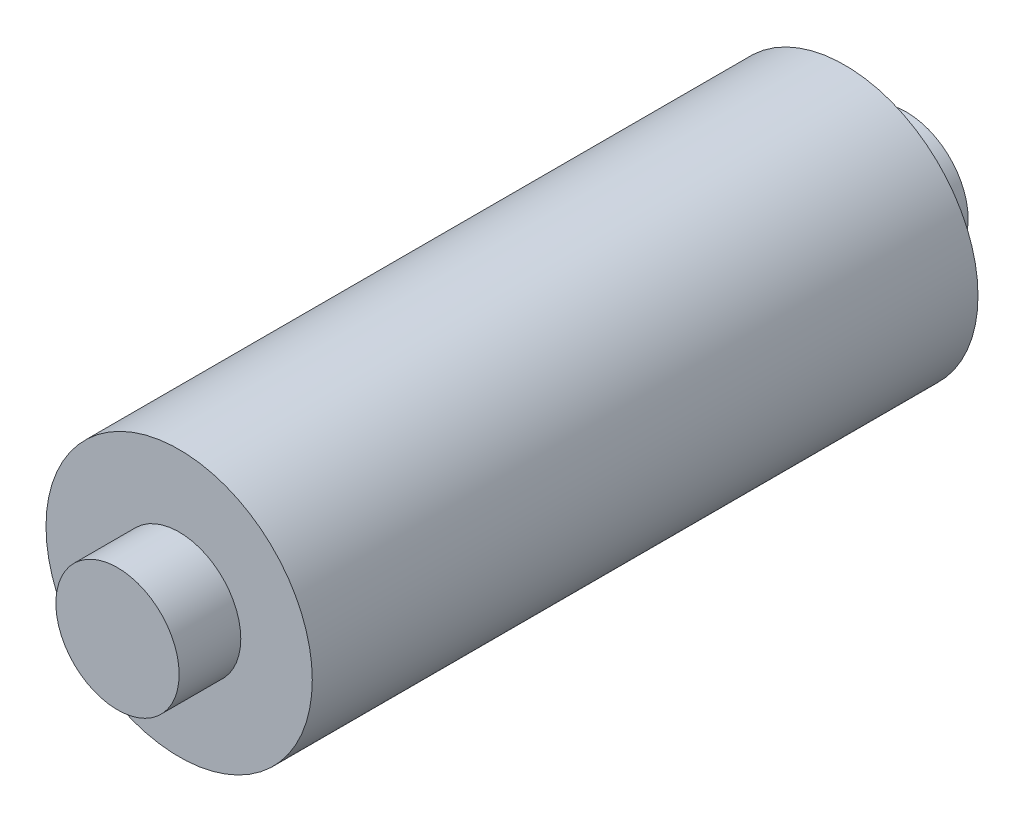
ISO-10303-21;
HEADER;
FILE_DESCRIPTION(('STEP AP214'),'2;1');
FILE_NAME('part.step','',(''),(''),'','','');
FILE_SCHEMA(('AUTOMOTIVE_DESIGN { 1 0 10303 214 1 1 1 1 }'));
ENDSEC;
DATA;
#1=APPLICATION_CONTEXT('core data for automotive mechanical design processes');
#2=APPLICATION_PROTOCOL_DEFINITION('international standard','automotive_design',2000,#1);
#3=PRODUCT_CONTEXT('',#1,'mechanical');
#4=PRODUCT('Part','Part','',(#3));
#5=PRODUCT_RELATED_PRODUCT_CATEGORY('part','',(#4));
#6=PRODUCT_DEFINITION_FORMATION('','',#4);
#7=PRODUCT_DEFINITION_CONTEXT('part definition',#1,'design');
#8=PRODUCT_DEFINITION('design','',#6,#7);
#9=PRODUCT_DEFINITION_SHAPE('','',#8);
#10=(LENGTH_UNIT() NAMED_UNIT(*) SI_UNIT(.MILLI.,.METRE.));
#11=(NAMED_UNIT(*) PLANE_ANGLE_UNIT() SI_UNIT($,.RADIAN.));
#12=(NAMED_UNIT(*) SI_UNIT($,.STERADIAN.) SOLID_ANGLE_UNIT());
#13=UNCERTAINTY_MEASURE_WITH_UNIT(LENGTH_MEASURE(1.E-05),#10,'distance_accuracy_value','');
#14=(GEOMETRIC_REPRESENTATION_CONTEXT(3) GLOBAL_UNCERTAINTY_ASSIGNED_CONTEXT((#13)) GLOBAL_UNIT_ASSIGNED_CONTEXT((#10,
#11,#12)) REPRESENTATION_CONTEXT('',''));
#15=CARTESIAN_POINT('',(0.,0.,0.));
#16=DIRECTION('',(0.,0.,1.));
#17=DIRECTION('',(1.,0.,0.));
#18=AXIS2_PLACEMENT_3D('',#15,#16,#17);
#19=CARTESIAN_POINT('',(0.,0.,0.));
#20=DIRECTION('',(0.,0.,1.));
#21=DIRECTION('',(1.,0.,0.));
#22=AXIS2_PLACEMENT_3D('',#19,#20,#21);
#23=PLANE('',#22);
#24=CARTESIAN_POINT('',(0.,0.,0.));
#25=DIRECTION('',(0.,0.,1.));
#26=DIRECTION('',(1.,0.,0.));
#27=AXIS2_PLACEMENT_3D('',#24,#25,#26);
#28=CIRCLE('',#27,54.);
#29=CARTESIAN_POINT('',(54.,0.,0.));
#30=VERTEX_POINT('',#29);
#31=EDGE_CURVE('E43',#30,#30,#28,.T.);
#32=ORIENTED_EDGE('',*,*,#31,.F.);
#33=EDGE_LOOP('',(#32));
#34=FACE_BOUND('',#33,.T.);
#35=CARTESIAN_POINT('',(0.,0.,0.));
#36=DIRECTION('',(0.,0.,1.));
#37=DIRECTION('',(1.,0.,0.));
#38=AXIS2_PLACEMENT_3D('',#35,#36,#37);
#39=CIRCLE('',#38,25.);
#40=CARTESIAN_POINT('',(25.,0.,0.));
#41=VERTEX_POINT('',#40);
#42=EDGE_CURVE('E10',#41,#41,#39,.F.);
#43=ORIENTED_EDGE('',*,*,#42,.F.);
#44=EDGE_LOOP('',(#43));
#45=FACE_BOUND('',#44,.T.);
#46=ADVANCED_FACE('F32',(#34,#45),#23,.F.);
#47=CARTESIAN_POINT('',(0.,0.,270.));
#48=DIRECTION('',(0.,0.,1.));
#49=DIRECTION('',(1.,0.,0.));
#50=AXIS2_PLACEMENT_3D('',#47,#48,#49);
#51=PLANE('',#50);
#52=CARTESIAN_POINT('',(0.,0.,270.));
#53=DIRECTION('',(0.,0.,1.));
#54=DIRECTION('',(1.,0.,0.));
#55=AXIS2_PLACEMENT_3D('',#52,#53,#54);
#56=CIRCLE('',#55,54.);
#57=CARTESIAN_POINT('',(54.,0.,270.));
#58=VERTEX_POINT('',#57);
#59=EDGE_CURVE('E39',#58,#58,#56,.T.);
#60=ORIENTED_EDGE('',*,*,#59,.T.);
#61=EDGE_LOOP('',(#60));
#62=FACE_BOUND('',#61,.T.);
#63=CARTESIAN_POINT('',(0.,0.,270.));
#64=DIRECTION('',(0.,0.,1.));
#65=DIRECTION('',(1.,0.,0.));
#66=AXIS2_PLACEMENT_3D('',#63,#64,#65);
#67=CIRCLE('',#66,25.);
#68=CARTESIAN_POINT('',(25.,0.,270.));
#69=VERTEX_POINT('',#68);
#70=EDGE_CURVE('E50',#69,#69,#67,.T.);
#71=ORIENTED_EDGE('',*,*,#70,.F.);
#72=EDGE_LOOP('',(#71));
#73=FACE_BOUND('',#72,.T.);
#74=ADVANCED_FACE('F74',(#62,#73),#51,.T.);
#75=CARTESIAN_POINT('',(0.,0.,270.));
#76=DIRECTION('',(0.,0.,-1.));
#77=DIRECTION('',(-1.,0.,0.));
#78=AXIS2_PLACEMENT_3D('',#75,#76,#77);
#79=CYLINDRICAL_SURFACE('',#78,54.);
#80=ORIENTED_EDGE('',*,*,#59,.F.);
#81=EDGE_LOOP('',(#80));
#82=FACE_BOUND('',#81,.T.);
#83=ORIENTED_EDGE('',*,*,#31,.T.);
#84=EDGE_LOOP('',(#83));
#85=FACE_BOUND('',#84,.T.);
#86=ADVANCED_FACE('F34',(#82,#85),#79,.T.);
#87=CARTESIAN_POINT('',(0.,0.,295.));
#88=DIRECTION('',(0.,0.,-1.));
#89=DIRECTION('',(-1.,0.,0.));
#90=AXIS2_PLACEMENT_3D('',#87,#88,#89);
#91=CYLINDRICAL_SURFACE('',#90,25.);
#92=CARTESIAN_POINT('',(0.,0.,295.));
#93=DIRECTION('',(0.,0.,1.));
#94=DIRECTION('',(1.,0.,0.));
#95=AXIS2_PLACEMENT_3D('',#92,#93,#94);
#96=CIRCLE('',#95,25.);
#97=CARTESIAN_POINT('',(25.,0.,295.));
#98=VERTEX_POINT('',#97);
#99=EDGE_CURVE('E48',#98,#98,#96,.T.);
#100=ORIENTED_EDGE('',*,*,#99,.F.);
#101=EDGE_LOOP('',(#100));
#102=FACE_BOUND('',#101,.T.);
#103=ORIENTED_EDGE('',*,*,#70,.T.);
#104=EDGE_LOOP('',(#103));
#105=FACE_BOUND('',#104,.T.);
#106=ADVANCED_FACE('F70',(#102,#105),#91,.T.);
#107=CARTESIAN_POINT('',(0.,0.,295.));
#108=DIRECTION('',(0.,0.,1.));
#109=DIRECTION('',(1.,0.,0.));
#110=AXIS2_PLACEMENT_3D('',#107,#108,#109);
#111=PLANE('',#110);
#112=ORIENTED_EDGE('',*,*,#99,.T.);
#113=EDGE_LOOP('',(#112));
#114=FACE_BOUND('',#113,.T.);
#115=ADVANCED_FACE('F63',(#114),#111,.T.);
#116=CARTESIAN_POINT('',(0.,0.,-25.));
#117=DIRECTION('',(0.,0.,1.));
#118=DIRECTION('',(1.,0.,0.));
#119=AXIS2_PLACEMENT_3D('',#116,#117,#118);
#120=CYLINDRICAL_SURFACE('',#119,25.);
#121=CARTESIAN_POINT('',(0.,0.,-25.));
#122=DIRECTION('',(0.,0.,-1.));
#123=DIRECTION('',(-1.,0.,0.));
#124=AXIS2_PLACEMENT_3D('',#121,#122,#123);
#125=CIRCLE('',#124,25.);
#126=CARTESIAN_POINT('',(-25.,0.,-25.));
#127=VERTEX_POINT('',#126);
#128=EDGE_CURVE('E53',#127,#127,#125,.T.);
#129=ORIENTED_EDGE('',*,*,#128,.F.);
#130=EDGE_LOOP('',(#129));
#131=FACE_BOUND('',#130,.T.);
#132=ORIENTED_EDGE('',*,*,#42,.T.);
#133=EDGE_LOOP('',(#132));
#134=FACE_BOUND('',#133,.T.);
#135=ADVANCED_FACE('F61',(#131,#134),#120,.T.);
#136=CARTESIAN_POINT('',(0.,0.,-25.));
#137=DIRECTION('',(0.,0.,-1.));
#138=DIRECTION('',(-1.,0.,0.));
#139=AXIS2_PLACEMENT_3D('',#136,#137,#138);
#140=PLANE('',#139);
#141=ORIENTED_EDGE('',*,*,#128,.T.);
#142=EDGE_LOOP('',(#141));
#143=FACE_BOUND('',#142,.T.);
#144=ADVANCED_FACE('F59',(#143),#140,.T.);
#145=CLOSED_SHELL('',(#46,#74,#86,#106,#115,#135,#144));
#146=MANIFOLD_SOLID_BREP('B2',#145);
#147=ADVANCED_BREP_SHAPE_REPRESENTATION('',(#18,#146),#14);
#148=SHAPE_DEFINITION_REPRESENTATION(#9,#147);
ENDSEC;
END-ISO-10303-21;
